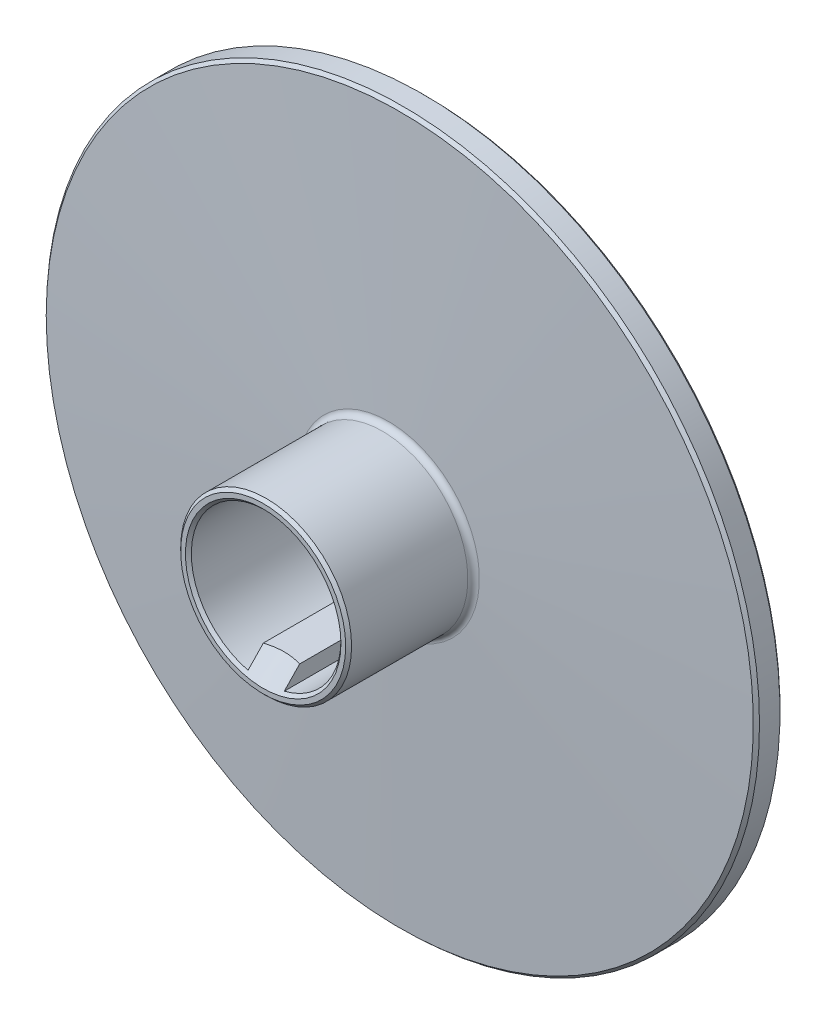
ISO-10303-21;
HEADER;
FILE_DESCRIPTION(('STEP AP214'),'2;1');
FILE_NAME('part.step','',(''),(''),'','','');
FILE_SCHEMA(('AUTOMOTIVE_DESIGN { 1 0 10303 214 1 1 1 1 }'));
ENDSEC;
DATA;
#1=APPLICATION_CONTEXT('core data for automotive mechanical design processes');
#2=APPLICATION_PROTOCOL_DEFINITION('international standard','automotive_design',2000,#1);
#3=PRODUCT_CONTEXT('',#1,'mechanical');
#4=PRODUCT('Part','Part','',(#3));
#5=PRODUCT_RELATED_PRODUCT_CATEGORY('part','',(#4));
#6=PRODUCT_DEFINITION_FORMATION('','',#4);
#7=PRODUCT_DEFINITION_CONTEXT('part definition',#1,'design');
#8=PRODUCT_DEFINITION('design','',#6,#7);
#9=PRODUCT_DEFINITION_SHAPE('','',#8);
#10=(LENGTH_UNIT() NAMED_UNIT(*) SI_UNIT(.MILLI.,.METRE.));
#11=(NAMED_UNIT(*) PLANE_ANGLE_UNIT() SI_UNIT($,.RADIAN.));
#12=(NAMED_UNIT(*) SI_UNIT($,.STERADIAN.) SOLID_ANGLE_UNIT());
#13=UNCERTAINTY_MEASURE_WITH_UNIT(LENGTH_MEASURE(1.E-05),#10,'distance_accuracy_value','');
#14=(GEOMETRIC_REPRESENTATION_CONTEXT(3) GLOBAL_UNCERTAINTY_ASSIGNED_CONTEXT((#13)) GLOBAL_UNIT_ASSIGNED_CONTEXT((#10,
#11,#12)) REPRESENTATION_CONTEXT('',''));
#15=CARTESIAN_POINT('',(0.,0.,0.));
#16=DIRECTION('',(0.,0.,1.));
#17=DIRECTION('',(1.,0.,0.));
#18=AXIS2_PLACEMENT_3D('',#15,#16,#17);
#19=CARTESIAN_POINT('',(-14.5,0.,33.7));
#20=DIRECTION('',(0.,0.,1.));
#21=DIRECTION('',(1.,0.,0.));
#22=AXIS2_PLACEMENT_3D('',#19,#20,#21);
#23=PLANE('',#22);
#24=CARTESIAN_POINT('',(0.,0.,33.7));
#25=DIRECTION('',(0.,0.,1.));
#26=DIRECTION('',(1.,0.,0.));
#27=AXIS2_PLACEMENT_3D('',#24,#25,#26);
#28=CIRCLE('',#27,14.);
#29=CARTESIAN_POINT('',(14.,0.,33.7));
#30=VERTEX_POINT('',#29);
#31=EDGE_CURVE('E222',#30,#30,#28,.T.);
#32=ORIENTED_EDGE('',*,*,#31,.T.);
#33=EDGE_LOOP('',(#32));
#34=FACE_BOUND('',#33,.T.);
#35=CARTESIAN_POINT('',(0.,0.,33.7));
#36=DIRECTION('',(0.,0.,1.));
#37=DIRECTION('',(1.,0.,0.));
#38=AXIS2_PLACEMENT_3D('',#35,#36,#37);
#39=CIRCLE('',#38,13.195);
#40=CARTESIAN_POINT('',(13.195,0.,33.7));
#41=VERTEX_POINT('',#40);
#42=EDGE_CURVE('E109',#41,#41,#39,.T.);
#43=ORIENTED_EDGE('',*,*,#42,.F.);
#44=EDGE_LOOP('',(#43));
#45=FACE_BOUND('',#44,.T.);
#46=ADVANCED_FACE('F43',(#34,#45),#23,.T.);
#47=CARTESIAN_POINT('',(0.,0.,0.));
#48=DIRECTION('',(0.,0.,1.));
#49=DIRECTION('',(1.,0.,0.));
#50=AXIS2_PLACEMENT_3D('',#47,#48,#49);
#51=CYLINDRICAL_SURFACE('',#50,12.695);
#52=CARTESIAN_POINT('',(0.,0.,0.));
#53=DIRECTION('',(0.,0.,1.));
#54=DIRECTION('',(1.,0.,0.));
#55=AXIS2_PLACEMENT_3D('',#52,#53,#54);
#56=CIRCLE('',#55,12.695);
#57=CARTESIAN_POINT('',(12.695,0.,0.));
#58=VERTEX_POINT('',#57);
#59=EDGE_CURVE('E240',#58,#58,#56,.T.);
#60=ORIENTED_EDGE('',*,*,#59,.F.);
#61=EDGE_LOOP('',(#60));
#62=FACE_BOUND('',#61,.T.);
#63=CARTESIAN_POINT('',(0.,0.,33.2));
#64=DIRECTION('',(0.,0.,1.));
#65=DIRECTION('',(1.,0.,0.));
#66=AXIS2_PLACEMENT_3D('',#63,#64,#65);
#67=CIRCLE('',#66,12.695);
#68=CARTESIAN_POINT('',(-3.075,-12.3169557927274,33.2));
#69=VERTEX_POINT('',#68);
#70=CARTESIAN_POINT('',(3.075,-12.3169557927274,33.2));
#71=VERTEX_POINT('',#70);
#72=EDGE_CURVE('E102',#69,#71,#67,.F.);
#73=ORIENTED_EDGE('',*,*,#72,.F.);
#74=DIRECTION('',(0.,0.,1.));
#75=VECTOR('',#74,1.);
#76=CARTESIAN_POINT('',(-3.075,-12.3169557927274,13.7));
#77=LINE('',#76,#75);
#78=CARTESIAN_POINT('',(-3.075,-12.3169557927274,14.4930442072727));
#79=VERTEX_POINT('',#78);
#80=EDGE_CURVE('E243',#79,#69,#77,.T.);
#81=ORIENTED_EDGE('',*,*,#80,.F.);
#82=CARTESIAN_POINT('',(0.,0.,26.8100000000002));
#83=DIRECTION('',(0.,0.707106781186551,-0.707106781186544));
#84=DIRECTION('',(0.,0.707106781186544,0.707106781186551));
#85=AXIS2_PLACEMENT_3D('',#82,#83,#84);
#86=ELLIPSE('',#85,17.9534411743265,12.695);
#87=CARTESIAN_POINT('',(3.075,-12.3169557927274,14.4930442072727));
#88=VERTEX_POINT('',#87);
#89=EDGE_CURVE('E58',#79,#88,#86,.F.);
#90=ORIENTED_EDGE('',*,*,#89,.T.);
#91=DIRECTION('',(0.,0.,1.));
#92=VECTOR('',#91,1.);
#93=CARTESIAN_POINT('',(3.075,-12.3169557927274,13.7));
#94=LINE('',#93,#92);
#95=EDGE_CURVE('E92',#88,#71,#94,.T.);
#96=ORIENTED_EDGE('',*,*,#95,.T.);
#97=EDGE_LOOP('',(#73,#81,#90,#96));
#98=FACE_BOUND('',#97,.T.);
#99=ADVANCED_FACE('F149',(#62,#98),#51,.F.);
#100=CARTESIAN_POINT('',(-3.075,-12.3169557927274,13.7));
#101=DIRECTION('',(-1.,0.,0.));
#102=DIRECTION('',(0.,0.,1.));
#103=AXIS2_PLACEMENT_3D('',#100,#101,#102);
#104=PLANE('',#103);
#105=DIRECTION('',(0.,0.,1.));
#106=VECTOR('',#105,1.);
#107=CARTESIAN_POINT('',(-3.075,-9.61,13.7));
#108=LINE('',#107,#106);
#109=CARTESIAN_POINT('',(-3.075,-9.61,17.2000000000001));
#110=VERTEX_POINT('',#109);
#111=CARTESIAN_POINT('',(-3.075,-9.61,30.5949814172277));
#112=VERTEX_POINT('',#111);
#113=EDGE_CURVE('E91',#110,#112,#108,.T.);
#114=ORIENTED_EDGE('',*,*,#113,.F.);
#115=DIRECTION('',(0.,-0.707106781186544,-0.707106781186551));
#116=VECTOR('',#115,1.);
#117=CARTESIAN_POINT('',(-3.075,-12.7134778963637,14.0965221036363));
#118=LINE('',#117,#116);
#119=EDGE_CURVE('E203',#110,#79,#118,.T.);
#120=ORIENTED_EDGE('',*,*,#119,.T.);
#121=ORIENTED_EDGE('',*,*,#80,.T.);
#122=CARTESIAN_POINT('',(-3.075,-16.4446644747525,37.2346926058785));
#123=CARTESIAN_POINT('',(-3.075,-16.1677862360648,36.9625333131866));
#124=CARTESIAN_POINT('',(-3.075,-15.8907938647849,36.6904901629675));
#125=CARTESIAN_POINT('',(-3.075,-15.3365379246369,36.1466798445369));
#126=CARTESIAN_POINT('',(-3.075,-15.059274355554,35.8749126765443));
#127=CARTESIAN_POINT('',(-3.075,-14.2271028429799,35.0601791897137));
#128=CARTESIAN_POINT('',(-3.075,-13.6717245654893,34.5176928296877));
#129=CARTESIAN_POINT('',(-3.075,-12.5596218359848,33.4349505824403));
#130=CARTESIAN_POINT('',(-3.075,-12.0028987330688,32.8946933100551));
#131=CARTESIAN_POINT('',(-3.075,-10.8867687744077,31.816770326622));
#132=CARTESIAN_POINT('',(-3.075,-10.3273614973255,31.2791050508895));
#133=CARTESIAN_POINT('',(-3.075,-9.48479183044669,30.4754507020256));
#134=CARTESIAN_POINT('',(-3.075,-9.20316229951289,30.207855254054));
#135=CARTESIAN_POINT('',(-3.075,-8.63857514852098,29.6740841048075));
#136=CARTESIAN_POINT('',(-3.075,-8.35561756670372,29.4079083631184));
#137=CARTESIAN_POINT('',(-3.075,-7.78806767612506,28.8775387579183));
#138=CARTESIAN_POINT('',(-3.075,-7.50347609219446,28.6133441199496));
#139=CARTESIAN_POINT('',(-3.075,-6.93189608596689,28.0874961983878));
#140=CARTESIAN_POINT('',(-3.075,-6.64490741266441,27.8258431873005));
#141=CARTESIAN_POINT('',(-3.075,-6.06722822566415,27.3058030379035));
#142=CARTESIAN_POINT('',(-3.075,-5.77653301306935,27.0474210938836));
#143=CARTESIAN_POINT('',(-3.075,-5.33693396746313,26.6640110336209));
#144=CARTESIAN_POINT('',(-3.075,-5.18983036718506,26.5369200624946));
#145=CARTESIAN_POINT('',(-3.075,-4.89413413816716,26.2844659756859));
#146=CARTESIAN_POINT('',(-3.075,-4.745541444885,26.1591029354622));
#147=CARTESIAN_POINT('',(-3.075,-4.44629407144802,25.9103880172487));
#148=CARTESIAN_POINT('',(-3.075,-4.29563659134671,25.7870394992981));
#149=CARTESIAN_POINT('',(-3.075,-3.99202986520318,25.543227710025));
#150=CARTESIAN_POINT('',(-3.075,-3.83908090572454,25.4227640827451));
#151=CARTESIAN_POINT('',(-3.075,-3.53008505213791,25.1855225796602));
#152=CARTESIAN_POINT('',(-3.075,-3.37403519062184,25.0687485416265));
#153=CARTESIAN_POINT('',(-3.075,-3.13708715737065,24.8974903372774));
#154=CARTESIAN_POINT('',(-3.075,-3.05760843489313,24.8410431804734));
#155=CARTESIAN_POINT('',(-3.075,-2.89755449301305,24.7297082760135));
#156=CARTESIAN_POINT('',(-3.075,-2.81697915534513,24.6748206985545));
#157=CARTESIAN_POINT('',(-3.075,-2.7357895650353,24.6208437220278));
#158=B_SPLINE_CURVE_WITH_KNOTS('',3,(#122,#123,#124,#125,#126,#127,#128,#129,#130,#131,#132,
#133,#134,#135,#136,#137,#138,#139,#140,#141,#142,#143,#144,#145,#146,#147,#148,#149,#150,#151,
#152,#153,#154,#155,#156,#157),.UNSPECIFIED.,.F.,.F.,(4,2,2,2,2,2,2,2,2,2,2,2,2,2,2,2,2,4),(0.,
1.16472739296026,2.32945570897109,4.65853560982455,6.9858398640117,9.31352223834014,
10.4789810750029,11.6444065560004,12.809349827676,13.9744166522994,15.1411463401531,
15.7243379188744,16.3075548853717,16.8916616157107,17.4756958997393,18.0603189104059,
18.3527545571148,18.6452219957069),.UNSPECIFIED.);
#159=EDGE_CURVE('E108',#69,#112,#158,.T.);
#160=ORIENTED_EDGE('',*,*,#159,.T.);
#161=EDGE_LOOP('',(#114,#120,#121,#160));
#162=FACE_BOUND('',#161,.T.);
#163=ADVANCED_FACE('F133',(#162),#104,.T.);
#164=CARTESIAN_POINT('',(-3.075,-9.61,13.7));
#165=DIRECTION('',(0.,1.,0.));
#166=DIRECTION('',(0.,0.,1.));
#167=AXIS2_PLACEMENT_3D('',#164,#165,#166);
#168=PLANE('',#167);
#169=DIRECTION('',(0.,0.,1.));
#170=VECTOR('',#169,1.);
#171=CARTESIAN_POINT('',(3.075,-9.61,13.7));
#172=LINE('',#171,#170);
#173=CARTESIAN_POINT('',(3.075,-9.61,17.2000000000001));
#174=VERTEX_POINT('',#173);
#175=CARTESIAN_POINT('',(3.075,-9.61,30.5949814172277));
#176=VERTEX_POINT('',#175);
#177=EDGE_CURVE('E81',#174,#176,#172,.T.);
#178=ORIENTED_EDGE('',*,*,#177,.F.);
#179=DIRECTION('',(-1.,0.,0.));
#180=VECTOR('',#179,1.);
#181=CARTESIAN_POINT('',(-3.075,-9.61,17.2000000000001));
#182=LINE('',#181,#180);
#183=EDGE_CURVE('E103',#174,#110,#182,.T.);
#184=ORIENTED_EDGE('',*,*,#183,.T.);
#185=ORIENTED_EDGE('',*,*,#113,.T.);
#186=CARTESIAN_POINT('',(-6.79762357745146,-9.61,32.2761420984));
#187=CARTESIAN_POINT('',(-6.62557662032749,-9.61,32.1768012971119));
#188=CARTESIAN_POINT('',(-6.45244053606338,-9.61,32.0793196729718));
#189=CARTESIAN_POINT('',(-6.103779800293,-9.61,31.8886216347219));
#190=CARTESIAN_POINT('',(-5.92825454384466,-9.61,31.7954063279312));
#191=CARTESIAN_POINT('',(-5.57398864840463,-9.61,31.6134775332071));
#192=CARTESIAN_POINT('',(-5.39523797660943,-9.61,31.5247834851891));
#193=CARTESIAN_POINT('',(-5.03508492186639,-9.61,31.3530018568147));
#194=CARTESIAN_POINT('',(-4.85368272204503,-9.61,31.2699138914821));
#195=CARTESIAN_POINT('',(-4.29961370824561,-9.61,31.0276968134661));
#196=CARTESIAN_POINT('',(-3.92252151864071,-9.61,30.8784598606364));
#197=CARTESIAN_POINT('',(-3.15703238978467,-9.61,30.6139345759531));
#198=CARTESIAN_POINT('',(-2.76865540956623,-9.61,30.4985898904294));
#199=CARTESIAN_POINT('',(-2.13611359057168,-9.61,30.3468037743358));
#200=CARTESIAN_POINT('',(-1.89509988037997,-9.61,30.2971567897843));
#201=CARTESIAN_POINT('',(-1.41011619384995,-9.61,30.2149675381337));
#202=CARTESIAN_POINT('',(-1.16614607439211,-9.61,30.1824261025244));
#203=CARTESIAN_POINT('',(-0.678456181416897,-9.61,30.1358869576372));
#204=CARTESIAN_POINT('',(-0.434750919192085,-9.61,30.1217386138091));
#205=CARTESIAN_POINT('',(0.0530333547881221,-9.61,30.112051550942));
#206=CARTESIAN_POINT('',(0.297112375028715,-9.61,30.1165132608497));
#207=CARTESIAN_POINT('',(0.821333873306593,-9.61,30.1459662260996));
#208=CARTESIAN_POINT('',(1.10130902391229,-9.61,30.1739797932255));
#209=CARTESIAN_POINT('',(1.65797893360702,-9.61,30.2530763687466));
#210=CARTESIAN_POINT('',(1.93467302401662,-9.61,30.3041639994393));
#211=CARTESIAN_POINT('',(2.48675226866024,-9.61,30.4278386769668));
#212=CARTESIAN_POINT('',(2.76207900209486,-9.61,30.5006835821635));
#213=CARTESIAN_POINT('',(3.30705706759394,-9.61,30.6647824900906));
#214=CARTESIAN_POINT('',(3.5767095671241,-9.61,30.7560326642447));
#215=CARTESIAN_POINT('',(4.19197603864613,-9.61,30.9845021416316));
#216=CARTESIAN_POINT('',(4.5355324443071,-9.61,31.1272378437436));
#217=CARTESIAN_POINT('',(5.21319787826299,-9.61,31.4337747267892));
#218=CARTESIAN_POINT('',(5.54730162685242,-9.61,31.5975874074029));
#219=CARTESIAN_POINT('',(6.20801907400099,-9.61,31.9423030464894));
#220=CARTESIAN_POINT('',(6.5346018704139,-9.61,32.1232647755324));
#221=CARTESIAN_POINT('',(7.18008086690026,-9.61,32.4981926672421));
#222=CARTESIAN_POINT('',(7.49897849482747,-9.61,32.6921563885019));
#223=CARTESIAN_POINT('',(8.11529067983245,-9.61,33.0809949563438));
#224=CARTESIAN_POINT('',(8.41300786398465,-9.61,33.2753926300923));
#225=CARTESIAN_POINT('',(9.00335025477699,-9.61,33.6717993943322));
#226=CARTESIAN_POINT('',(9.29597504323243,-9.61,33.8738091056483));
#227=CARTESIAN_POINT('',(9.87432008759516,-9.61,34.2822516343032));
#228=CARTESIAN_POINT('',(10.160078173652,-9.61,34.4886310732012));
#229=CARTESIAN_POINT('',(10.7277790558356,-9.61,34.906417444048));
#230=CARTESIAN_POINT('',(11.0097228740249,-9.61,35.1178229856014));
#231=CARTESIAN_POINT('',(11.2900880913767,-9.61,35.3312668636122));
#232=B_SPLINE_CURVE_WITH_KNOTS('',3,(#186,#187,#188,#189,#190,#191,#192,#193,#194,#195,#196,
#197,#198,#199,#200,#201,#202,#203,#204,#205,#206,#207,#208,#209,#210,#211,#212,#213,#214,#215,
#216,#217,#218,#219,#220,#221,#222,#223,#224,#225,#226,#227,#228,#229,#230,#231),.UNSPECIFIED.,
.F.,.F.,(4,2,2,2,2,2,2,2,2,2,2,2,2,2,2,2,2,2,2,2,2,2,4),(0.,0.596009878422831,1.19217358347285,
1.79071526127652,2.38921579460725,3.60459016431211,4.81793210904762,5.55562336232361,
6.29335047098304,7.02499691670724,7.75666022638449,8.59972351915994,9.44295577302999,
10.296607469739,11.150081776684,12.2652223201028,13.3809738891778,14.5006979036308,
15.62021225133,16.686766391578,17.7534077072479,18.8108220768357,19.8679472562639),.UNSPECIFIED.);
#233=EDGE_CURVE('E99',#112,#176,#232,.T.);
#234=ORIENTED_EDGE('',*,*,#233,.T.);
#235=EDGE_LOOP('',(#178,#184,#185,#234));
#236=FACE_BOUND('',#235,.T.);
#237=ADVANCED_FACE('F106',(#236),#168,.T.);
#238=CARTESIAN_POINT('',(3.075,-12.3169557927274,13.7));
#239=DIRECTION('',(1.,0.,0.));
#240=DIRECTION('',(0.,0.,-1.));
#241=AXIS2_PLACEMENT_3D('',#238,#239,#240);
#242=PLANE('',#241);
#243=ORIENTED_EDGE('',*,*,#95,.F.);
#244=DIRECTION('',(0.,0.707106781186544,0.707106781186551));
#245=VECTOR('',#244,1.);
#246=CARTESIAN_POINT('',(3.075,-12.7134778963637,14.0965221036363));
#247=LINE('',#246,#245);
#248=EDGE_CURVE('E86',#88,#174,#247,.T.);
#249=ORIENTED_EDGE('',*,*,#248,.T.);
#250=ORIENTED_EDGE('',*,*,#177,.T.);
#251=CARTESIAN_POINT('',(3.075,-2.7357895650353,24.6208437220278));
#252=CARTESIAN_POINT('',(3.075,-2.8200841733317,24.676888618064));
#253=CARTESIAN_POINT('',(3.075,-2.90371958637137,24.7339118082354));
#254=CARTESIAN_POINT('',(3.075,-3.06981333236709,24.8496286235785));
#255=CARTESIAN_POINT('',(3.075,-3.15227180335314,24.9083220504097));
#256=CARTESIAN_POINT('',(3.075,-3.31613675478941,25.0270804204322));
#257=CARTESIAN_POINT('',(3.075,-3.39754368248909,25.0871447483026));
#258=CARTESIAN_POINT('',(3.075,-3.55946872628302,25.2084635600195));
#259=CARTESIAN_POINT('',(3.075,-3.6399868121207,25.2697180841861));
#260=CARTESIAN_POINT('',(3.075,-3.88020039385183,25.4548631656667));
#261=CARTESIAN_POINT('',(3.075,-4.03873189017413,25.5802644451658));
#262=CARTESIAN_POINT('',(3.075,-4.35339164711366,25.8340729888377));
#263=CARTESIAN_POINT('',(3.075,-4.50951958807305,25.9624806472123));
#264=CARTESIAN_POINT('',(3.075,-4.81961857223347,26.2213870263406));
#265=CARTESIAN_POINT('',(3.075,-4.97359258012751,26.3518822025072));
#266=CARTESIAN_POINT('',(3.075,-5.28000055140545,26.6146504096596));
#267=CARTESIAN_POINT('',(3.075,-5.43243458586553,26.7469233579309));
#268=CARTESIAN_POINT('',(3.075,-5.73610369739013,27.0129294798348));
#269=CARTESIAN_POINT('',(3.075,-5.88733839534715,27.1466630857253));
#270=CARTESIAN_POINT('',(3.075,-6.18878336256179,27.4152820407836));
#271=CARTESIAN_POINT('',(3.075,-6.33899362005434,27.5501674031388));
#272=CARTESIAN_POINT('',(3.075,-6.76585355197218,27.93589871173));
#273=CARTESIAN_POINT('',(3.075,-7.04147684777185,28.1878802428342));
#274=CARTESIAN_POINT('',(3.075,-7.59058417895442,28.6940985201818));
#275=CARTESIAN_POINT('',(3.075,-7.86406844133737,28.9483350208392));
#276=CARTESIAN_POINT('',(3.075,-8.40963312309638,29.4586722678215));
#277=CARTESIAN_POINT('',(3.075,-8.68171248359501,29.714774145219));
#278=CARTESIAN_POINT('',(3.075,-9.22465558622633,30.2282794239617));
#279=CARTESIAN_POINT('',(3.075,-9.49551928896499,30.4856828669181));
#280=CARTESIAN_POINT('',(3.075,-10.3279621976556,31.2796776540167));
#281=CARTESIAN_POINT('',(3.075,-10.8879656899572,31.8179204491862));
#282=CARTESIAN_POINT('',(3.075,-12.0053717124883,32.8970874058707));
#283=CARTESIAN_POINT('',(3.075,-12.5627742560463,33.4380115536158));
#284=CARTESIAN_POINT('',(3.075,-13.6749593019903,34.5208504299196));
#285=CARTESIAN_POINT('',(3.075,-14.2297445051434,35.0627623855056));
#286=CARTESIAN_POINT('',(3.075,-15.0609820387358,35.8765861264441));
#287=CARTESIAN_POINT('',(3.075,-15.3379035829512,36.1480191013643));
#288=CARTESIAN_POINT('',(3.075,-15.8914761947861,36.691160299024));
#289=CARTESIAN_POINT('',(3.075,-16.1681272626192,36.9628685215457));
#290=CARTESIAN_POINT('',(3.075,-16.4446644747525,37.2346926058785));
#291=B_SPLINE_CURVE_WITH_KNOTS('',3,(#251,#252,#253,#254,#255,#256,#257,#258,#259,#260,#261,
#262,#263,#264,#265,#266,#267,#268,#269,#270,#271,#272,#273,#274,#275,#276,#277,#278,#279,#280,
#281,#282,#283,#284,#285,#286,#287,#288,#289,#290),.UNSPECIFIED.,.F.,.F.,(4,2,2,2,2,2,2,2,2,2,2,
2,2,2,2,2,2,2,2,4),(0.,0.303659187927709,0.6072824655991,0.910772044370865,1.21427192239943,
1.82061523644861,2.42703850559754,3.03252305134819,3.63797952260694,4.24362030438228,
4.84926802989535,5.96958931533973,7.08979005058529,8.21073849423838,9.3317230042708,
11.6618953018111,13.9920556453601,16.3186586565968,17.4819524045281,18.6452452323606),.UNSPECIFIED.);
#292=EDGE_CURVE('E84',#176,#71,#291,.T.);
#293=ORIENTED_EDGE('',*,*,#292,.T.);
#294=EDGE_LOOP('',(#243,#249,#250,#293));
#295=FACE_BOUND('',#294,.T.);
#296=ADVANCED_FACE('F83',(#295),#242,.T.);
#297=CARTESIAN_POINT('',(0.,0.,6.));
#298=DIRECTION('',(0.,0.,-1.));
#299=DIRECTION('',(-1.,0.,0.));
#300=AXIS2_PLACEMENT_3D('',#297,#298,#299);
#301=CYLINDRICAL_SURFACE('',#300,22.25);
#302=CARTESIAN_POINT('',(0.,0.,0.5));
#303=DIRECTION('',(0.,0.,1.));
#304=DIRECTION('',(1.,0.,0.));
#305=AXIS2_PLACEMENT_3D('',#302,#303,#304);
#306=CIRCLE('',#305,22.25);
#307=CARTESIAN_POINT('',(22.25,0.,0.5));
#308=VERTEX_POINT('',#307);
#309=EDGE_CURVE('E231',#308,#308,#306,.T.);
#310=ORIENTED_EDGE('',*,*,#309,.T.);
#311=EDGE_LOOP('',(#310));
#312=FACE_BOUND('',#311,.T.);
#313=CARTESIAN_POINT('',(0.,0.,5.));
#314=DIRECTION('',(0.,0.,-1.));
#315=DIRECTION('',(-1.,0.,0.));
#316=AXIS2_PLACEMENT_3D('',#313,#314,#315);
#317=CIRCLE('',#316,22.25);
#318=CARTESIAN_POINT('',(-22.25,0.,5.));
#319=VERTEX_POINT('',#318);
#320=EDGE_CURVE('E234',#319,#319,#317,.T.);
#321=ORIENTED_EDGE('',*,*,#320,.T.);
#322=EDGE_LOOP('',(#321));
#323=FACE_BOUND('',#322,.T.);
#324=ADVANCED_FACE('F148',(#312,#323),#301,.T.);
#325=CARTESIAN_POINT('',(0.,0.,0.));
#326=DIRECTION('',(0.,0.,1.));
#327=DIRECTION('',(1.,0.,0.));
#328=AXIS2_PLACEMENT_3D('',#325,#326,#327);
#329=PLANE('',#328);
#330=CARTESIAN_POINT('',(0.,0.,0.));
#331=DIRECTION('',(0.,0.,1.));
#332=DIRECTION('',(1.,0.,0.));
#333=AXIS2_PLACEMENT_3D('',#330,#331,#332);
#334=CIRCLE('',#333,21.75);
#335=CARTESIAN_POINT('',(21.75,0.,0.));
#336=VERTEX_POINT('',#335);
#337=EDGE_CURVE('E228',#336,#336,#334,.F.);
#338=ORIENTED_EDGE('',*,*,#337,.T.);
#339=EDGE_LOOP('',(#338));
#340=FACE_BOUND('',#339,.T.);
#341=ORIENTED_EDGE('',*,*,#59,.T.);
#342=EDGE_LOOP('',(#341));
#343=FACE_BOUND('',#342,.T.);
#344=ADVANCED_FACE('F166',(#340,#343),#329,.F.);
#345=CARTESIAN_POINT('',(-60.5,0.,6.));
#346=DIRECTION('',(0.,0.,-1.));
#347=DIRECTION('',(-1.,0.,0.));
#348=AXIS2_PLACEMENT_3D('',#345,#346,#347);
#349=PLANE('',#348);
#350=CARTESIAN_POINT('',(0.,0.,6.));
#351=DIRECTION('',(0.,0.,-1.));
#352=DIRECTION('',(-1.,0.,0.));
#353=AXIS2_PLACEMENT_3D('',#350,#351,#352);
#354=CIRCLE('',#353,60.);
#355=CARTESIAN_POINT('',(-60.,0.,6.));
#356=VERTEX_POINT('',#355);
#357=EDGE_CURVE('E217',#356,#356,#354,.T.);
#358=ORIENTED_EDGE('',*,*,#357,.T.);
#359=EDGE_LOOP('',(#358));
#360=FACE_BOUND('',#359,.T.);
#361=CARTESIAN_POINT('',(0.,0.,6.));
#362=DIRECTION('',(0.,0.,-1.));
#363=DIRECTION('',(-1.,0.,0.));
#364=AXIS2_PLACEMENT_3D('',#361,#362,#363);
#365=CIRCLE('',#364,23.25);
#366=CARTESIAN_POINT('',(-23.25,0.,6.));
#367=VERTEX_POINT('',#366);
#368=EDGE_CURVE('E237',#367,#367,#365,.F.);
#369=ORIENTED_EDGE('',*,*,#368,.T.);
#370=EDGE_LOOP('',(#369));
#371=FACE_BOUND('',#370,.T.);
#372=ADVANCED_FACE('F162',(#360,#371),#349,.T.);
#373=CARTESIAN_POINT('',(0.,0.,10.5));
#374=DIRECTION('',(0.,0.,-1.));
#375=DIRECTION('',(-1.,0.,0.));
#376=AXIS2_PLACEMENT_3D('',#373,#374,#375);
#377=CONICAL_SURFACE('',#376,60.5,1.52716309549505);
#378=CARTESIAN_POINT('',(0.,0.,12.4666468944641));
#379=DIRECTION('',(0.,0.,-1.));
#380=DIRECTION('',(-1.,0.,0.));
#381=AXIS2_PLACEMENT_3D('',#378,#379,#380);
#382=CIRCLE('',#381,15.4563806126347);
#383=CARTESIAN_POINT('',(-15.4563806126355,0.,12.4666468944641));
#384=VERTEX_POINT('',#383);
#385=EDGE_CURVE('E52',#384,#384,#382,.T.);
#386=CARTESIAN_POINT('',(0.,0.,10.5218096936827));
#387=DIRECTION('',(0.,0.,1.));
#388=DIRECTION('',(1.,0.,0.));
#389=AXIS2_PLACEMENT_3D('',#386,#387,#388);
#390=CIRCLE('',#389,60.0004758892091);
#391=CARTESIAN_POINT('',(-60.0004758892091,0.,10.5218096936827));
#392=VERTEX_POINT('',#391);
#393=EDGE_CURVE('E104',#392,#392,#390,.T.);
#394=CARTESIAN_POINT('',(-15.4563806126355,0.,12.4666468944641));
#395=CARTESIAN_POINT('',(-15.9203816050998,0.,12.4463881736227));
#396=CARTESIAN_POINT('',(-16.3843825975641,0.,12.4261294527812));
#397=CARTESIAN_POINT('',(-17.3123845824927,0.,12.3856120110982));
#398=CARTESIAN_POINT('',(-17.776385574957,0.,12.3653532902568));
#399=CARTESIAN_POINT('',(-18.7043875598857,0.,12.3248358485738));
#400=CARTESIAN_POINT('',(-19.16838855235,0.,12.3045771277324));
#401=CARTESIAN_POINT('',(-20.0963905372786,0.,12.2640596860494));
#402=CARTESIAN_POINT('',(-20.5603915297429,0.,12.2438009652079));
#403=CARTESIAN_POINT('',(-21.4883935146715,0.,12.203283523525));
#404=CARTESIAN_POINT('',(-21.9523945071358,0.,12.1830248026835));
#405=CARTESIAN_POINT('',(-22.8803964920644,0.,12.1425073610006));
#406=CARTESIAN_POINT('',(-23.3443974845287,0.,12.1222486401591));
#407=CARTESIAN_POINT('',(-24.2723994694574,0.,12.0817311984761));
#408=CARTESIAN_POINT('',(-24.7364004619217,0.,12.0614724776347));
#409=CARTESIAN_POINT('',(-25.6644024468503,0.,12.0209550359517));
#410=CARTESIAN_POINT('',(-26.1284034393146,0.,12.0006963151102));
#411=CARTESIAN_POINT('',(-27.0564054242432,0.,11.9601788734273));
#412=CARTESIAN_POINT('',(-27.5204064167075,0.,11.9399201525858));
#413=CARTESIAN_POINT('',(-28.4484084016361,0.,11.8994027109029));
#414=CARTESIAN_POINT('',(-28.9124093941005,0.,11.8791439900614));
#415=CARTESIAN_POINT('',(-29.8404113790291,0.,11.8386265483785));
#416=CARTESIAN_POINT('',(-30.3044123714934,0.,11.818367827537));
#417=CARTESIAN_POINT('',(-31.232414356422,0.,11.777850385854));
#418=CARTESIAN_POINT('',(-31.6964153488863,0.,11.7575916650126));
#419=CARTESIAN_POINT('',(-32.6244173338149,0.,11.7170742233296));
#420=CARTESIAN_POINT('',(-33.0884183262792,0.,11.6968155024881));
#421=CARTESIAN_POINT('',(-34.0164203112079,0.,11.6562980608052));
#422=CARTESIAN_POINT('',(-34.4804213036722,0.,11.6360393399637));
#423=CARTESIAN_POINT('',(-35.4084232886008,0.,11.5955218982808));
#424=CARTESIAN_POINT('',(-35.8724242810651,0.,11.5752631774393));
#425=CARTESIAN_POINT('',(-36.8004262659937,0.,11.5347457357563));
#426=CARTESIAN_POINT('',(-37.264427258458,0.,11.5144870149149));
#427=CARTESIAN_POINT('',(-38.1924292433866,0.,11.4739695732319));
#428=CARTESIAN_POINT('',(-38.6564302358509,0.,11.4537108523905));
#429=CARTESIAN_POINT('',(-39.5844322207795,0.,11.4131934107075));
#430=CARTESIAN_POINT('',(-40.0484332132439,0.,11.392934689866));
#431=CARTESIAN_POINT('',(-40.9764351981725,0.,11.3524172481831));
#432=CARTESIAN_POINT('',(-41.4404361906368,0.,11.3321585273416));
#433=CARTESIAN_POINT('',(-42.3684381755654,0.,11.2916410856587));
#434=CARTESIAN_POINT('',(-42.8324391680297,0.,11.2713823648172));
#435=CARTESIAN_POINT('',(-43.7604411529583,0.,11.2308649231342));
#436=CARTESIAN_POINT('',(-44.2244421454226,0.,11.2106062022928));
#437=CARTESIAN_POINT('',(-45.1524441303512,0.,11.1700887606098));
#438=CARTESIAN_POINT('',(-45.6164451228156,0.,11.1498300397684));
#439=CARTESIAN_POINT('',(-46.5444471077442,0.,11.1093125980854));
#440=CARTESIAN_POINT('',(-47.0084481002085,0.,11.0890538772439));
#441=CARTESIAN_POINT('',(-47.9364500851371,0.,11.048536435561));
#442=CARTESIAN_POINT('',(-48.4004510776014,0.,11.0282777147195));
#443=CARTESIAN_POINT('',(-49.32845306253,0.,10.9877602730366));
#444=CARTESIAN_POINT('',(-49.7924540549943,0.,10.9675015521951));
#445=CARTESIAN_POINT('',(-50.720456039923,0.,10.9269841105121));
#446=CARTESIAN_POINT('',(-51.1844570323873,0.,10.9067253896707));
#447=CARTESIAN_POINT('',(-52.1124590173159,0.,10.8662079479877));
#448=CARTESIAN_POINT('',(-52.5764600097802,0.,10.8459492271462));
#449=CARTESIAN_POINT('',(-53.5044619947088,0.,10.8054317854633));
#450=CARTESIAN_POINT('',(-53.9684629871731,0.,10.7851730646218));
#451=CARTESIAN_POINT('',(-54.8964649721017,0.,10.7446556229389));
#452=CARTESIAN_POINT('',(-55.360465964566,0.,10.7243969020974));
#453=CARTESIAN_POINT('',(-56.2884679494947,0.,10.6838794604145));
#454=CARTESIAN_POINT('',(-56.752468941959,0.,10.663620739573));
#455=CARTESIAN_POINT('',(-57.6804709268876,0.,10.62310329789));
#456=CARTESIAN_POINT('',(-58.1444719193519,0.,10.6028445770486));
#457=CARTESIAN_POINT('',(-59.0724739042805,0.,10.5623271353656));
#458=CARTESIAN_POINT('',(-59.5364748967448,0.,10.5420684145241));
#459=CARTESIAN_POINT('',(-60.0004758892091,0.,10.5218096936827));
#460=B_SPLINE_CURVE_WITH_KNOTS('',3,(#394,#395,#396,#397,#398,#399,#400,#401,#402,#403,#404,
#405,#406,#407,#408,#409,#410,#411,#412,#413,#414,#415,#416,#417,#418,#419,#420,#421,#422,#423,
#424,#425,#426,#427,#428,#429,#430,#431,#432,#433,#434,#435,#436,#437,#438,#439,#440,#441,#442,
#443,#444,#445,#446,#447,#448,#449,#450,#451,#452,#453,#454,#455,#456,#457,#458,#459),
.UNSPECIFIED.,.F.,.F.,(4,2,2,2,2,2,2,2,2,2,2,2,2,2,2,2,2,2,2,2,2,2,2,2,2,2,2,2,2,2,2,2,4),(0.,
1.39332911797679,2.78665823595357,4.17998735393036,5.57331647190714,6.96664558988393,
8.35997470786071,9.75330382583749,11.1466329438143,12.5399620617911,13.9332911797679,
15.3266202977446,16.7199494157214,18.1132785336982,19.506607651675,20.8999367696518,
22.2932658876286,23.6865950056054,25.0799241235821,26.4732532415589,27.8665823595357,
29.2599114775125,30.6532405954893,32.0465697134661,33.4398988314429,34.8332279494196,
36.2265570673964,37.6198861853732,39.01321530335,40.4065444213268,41.7998735393036,
43.1932026572803,44.5865317752571),.UNSPECIFIED.);
#461=EDGE_CURVE('BSEAM165',#384,#392,#460,.T.);
#462=ORIENTED_EDGE('',*,*,#385,.T.);
#463=ORIENTED_EDGE('',*,*,#393,.T.);
#464=ORIENTED_EDGE('',*,*,#461,.T.);
#465=ORIENTED_EDGE('',*,*,#461,.F.);
#466=EDGE_LOOP('',(#462,#464,#463,#465));
#467=FACE_BOUND('',#466,.T.);
#468=ADVANCED_FACE('F165',(#467),#377,.T.);
#469=CARTESIAN_POINT('',(0.,0.,33.7));
#470=DIRECTION('',(0.,0.,-1.));
#471=DIRECTION('',(-1.,0.,0.));
#472=AXIS2_PLACEMENT_3D('',#469,#470,#471);
#473=CYLINDRICAL_SURFACE('',#472,60.5);
#474=CARTESIAN_POINT('',(0.,0.,6.49999999999999));
#475=DIRECTION('',(0.,0.,-1.));
#476=DIRECTION('',(-1.,0.,0.));
#477=AXIS2_PLACEMENT_3D('',#474,#475,#476);
#478=CIRCLE('',#477,60.5);
#479=CARTESIAN_POINT('',(-60.5,0.,6.49999999999999));
#480=VERTEX_POINT('',#479);
#481=EDGE_CURVE('E212',#480,#480,#478,.F.);
#482=ORIENTED_EDGE('',*,*,#481,.T.);
#483=EDGE_LOOP('',(#482));
#484=FACE_BOUND('',#483,.T.);
#485=CARTESIAN_POINT('',(0.,0.,9.97667478508751));
#486=DIRECTION('',(0.,0.,1.));
#487=DIRECTION('',(1.,0.,0.));
#488=AXIS2_PLACEMENT_3D('',#485,#486,#487);
#489=CIRCLE('',#488,60.5);
#490=CARTESIAN_POINT('',(60.5,0.,9.97667478508751));
#491=VERTEX_POINT('',#490);
#492=EDGE_CURVE('E214',#491,#491,#489,.F.);
#493=ORIENTED_EDGE('',*,*,#492,.T.);
#494=EDGE_LOOP('',(#493));
#495=FACE_BOUND('',#494,.T.);
#496=ADVANCED_FACE('F157',(#484,#495),#473,.T.);
#497=CARTESIAN_POINT('',(0.,0.,33.7));
#498=DIRECTION('',(0.,0.,-1.));
#499=DIRECTION('',(-1.,0.,0.));
#500=AXIS2_PLACEMENT_3D('',#497,#498,#499);
#501=CYLINDRICAL_SURFACE('',#500,14.5);
#502=CARTESIAN_POINT('',(0.,0.,13.465695116046));
#503=DIRECTION('',(0.,0.,-1.));
#504=DIRECTION('',(-1.,0.,0.));
#505=AXIS2_PLACEMENT_3D('',#502,#503,#504);
#506=CIRCLE('',#505,14.5);
#507=CARTESIAN_POINT('',(-14.5,0.,13.465695116046));
#508=VERTEX_POINT('',#507);
#509=EDGE_CURVE('E11',#508,#508,#506,.F.);
#510=ORIENTED_EDGE('',*,*,#509,.T.);
#511=EDGE_LOOP('',(#510));
#512=FACE_BOUND('',#511,.T.);
#513=CARTESIAN_POINT('',(0.,0.,33.2));
#514=DIRECTION('',(0.,0.,1.));
#515=DIRECTION('',(1.,0.,0.));
#516=AXIS2_PLACEMENT_3D('',#513,#514,#515);
#517=CIRCLE('',#516,14.5);
#518=CARTESIAN_POINT('',(14.5,0.,33.2));
#519=VERTEX_POINT('',#518);
#520=EDGE_CURVE('E225',#519,#519,#517,.F.);
#521=ORIENTED_EDGE('',*,*,#520,.T.);
#522=EDGE_LOOP('',(#521));
#523=FACE_BOUND('',#522,.T.);
#524=ADVANCED_FACE('F153',(#512,#523),#501,.T.);
#525=CARTESIAN_POINT('',(0.,0.,5.));
#526=DIRECTION('',(0.,0.,-1.));
#527=DIRECTION('',(-1.,0.,0.));
#528=AXIS2_PLACEMENT_3D('',#525,#526,#527);
#529=TOROIDAL_SURFACE('',#528,23.25,1.);
#530=ORIENTED_EDGE('',*,*,#320,.F.);
#531=EDGE_LOOP('',(#530));
#532=FACE_BOUND('',#531,.T.);
#533=ORIENTED_EDGE('',*,*,#368,.F.);
#534=EDGE_LOOP('',(#533));
#535=FACE_BOUND('',#534,.T.);
#536=ADVANCED_FACE('F156',(#532,#535),#529,.F.);
#537=CARTESIAN_POINT('',(0.,0.,0.5));
#538=DIRECTION('',(0.,0.,1.));
#539=DIRECTION('',(1.,0.,0.));
#540=AXIS2_PLACEMENT_3D('',#537,#538,#539);
#541=CONICAL_SURFACE('',#540,22.25,0.785398163397455);
#542=ORIENTED_EDGE('',*,*,#337,.F.);
#543=EDGE_LOOP('',(#542));
#544=FACE_BOUND('',#543,.T.);
#545=ORIENTED_EDGE('',*,*,#309,.F.);
#546=EDGE_LOOP('',(#545));
#547=FACE_BOUND('',#546,.T.);
#548=ADVANCED_FACE('F182',(#544,#547),#541,.T.);
#549=CARTESIAN_POINT('',(0.,0.,33.2));
#550=DIRECTION('',(0.,0.,-1.));
#551=DIRECTION('',(-1.,0.,0.));
#552=AXIS2_PLACEMENT_3D('',#549,#550,#551);
#553=CONICAL_SURFACE('',#552,14.5,0.78539816339745);
#554=ORIENTED_EDGE('',*,*,#31,.F.);
#555=EDGE_LOOP('',(#554));
#556=FACE_BOUND('',#555,.T.);
#557=ORIENTED_EDGE('',*,*,#520,.F.);
#558=EDGE_LOOP('',(#557));
#559=FACE_BOUND('',#558,.T.);
#560=ADVANCED_FACE('F186',(#556,#559),#553,.T.);
#561=CARTESIAN_POINT('',(0.,0.,6.));
#562=DIRECTION('',(0.,0.,1.));
#563=DIRECTION('',(1.,0.,0.));
#564=AXIS2_PLACEMENT_3D('',#561,#562,#563);
#565=CONICAL_SURFACE('',#564,60.,0.785398163397483);
#566=ORIENTED_EDGE('',*,*,#481,.F.);
#567=EDGE_LOOP('',(#566));
#568=FACE_BOUND('',#567,.T.);
#569=ORIENTED_EDGE('',*,*,#357,.F.);
#570=EDGE_LOOP('',(#569));
#571=FACE_BOUND('',#570,.T.);
#572=ADVANCED_FACE('F190',(#568,#571),#565,.T.);
#573=CARTESIAN_POINT('',(0.,0.,9.97667478508751));
#574=DIRECTION('',(0.,0.,-1.));
#575=DIRECTION('',(-1.,0.,0.));
#576=AXIS2_PLACEMENT_3D('',#573,#574,#575);
#577=CONICAL_SURFACE('',#576,60.5,0.741764932097604);
#578=ORIENTED_EDGE('',*,*,#393,.F.);
#579=EDGE_LOOP('',(#578));
#580=FACE_BOUND('',#579,.T.);
#581=ORIENTED_EDGE('',*,*,#492,.F.);
#582=EDGE_LOOP('',(#581));
#583=FACE_BOUND('',#582,.T.);
#584=ADVANCED_FACE('F131',(#580,#583),#577,.T.);
#585=CARTESIAN_POINT('',(0.,0.,29.7));
#586=DIRECTION('',(0.,0.,1.));
#587=DIRECTION('',(1.,0.,0.));
#588=AXIS2_PLACEMENT_3D('',#585,#586,#587);
#589=CONICAL_SURFACE('',#588,9.195,0.785398163397448);
#590=ORIENTED_EDGE('',*,*,#42,.T.);
#591=EDGE_LOOP('',(#590));
#592=FACE_BOUND('',#591,.T.);
#593=ORIENTED_EDGE('',*,*,#72,.T.);
#594=ORIENTED_EDGE('',*,*,#292,.F.);
#595=ORIENTED_EDGE('',*,*,#233,.F.);
#596=ORIENTED_EDGE('',*,*,#159,.F.);
#597=EDGE_LOOP('',(#593,#594,#595,#596));
#598=FACE_BOUND('',#597,.T.);
#599=ADVANCED_FACE('F97',(#592,#598),#589,.F.);
#600=CARTESIAN_POINT('',(-3.075,-9.61,17.2000000000001));
#601=DIRECTION('',(0.,0.707106781186551,-0.707106781186544));
#602=DIRECTION('',(1.,0.,0.));
#603=AXIS2_PLACEMENT_3D('',#600,#601,#602);
#604=PLANE('',#603);
#605=ORIENTED_EDGE('',*,*,#248,.F.);
#606=ORIENTED_EDGE('',*,*,#89,.F.);
#607=ORIENTED_EDGE('',*,*,#119,.F.);
#608=ORIENTED_EDGE('',*,*,#183,.F.);
#609=EDGE_LOOP('',(#605,#606,#607,#608));
#610=FACE_BOUND('',#609,.T.);
#611=ADVANCED_FACE('F130',(#610),#604,.T.);
#612=CARTESIAN_POINT('',(0.,0.,13.465695116046));
#613=DIRECTION('',(0.,0.,-1.));
#614=DIRECTION('',(-1.,0.,0.));
#615=AXIS2_PLACEMENT_3D('',#612,#613,#614);
#616=TOROIDAL_SURFACE('',#615,15.5,1.);
#617=ORIENTED_EDGE('',*,*,#509,.F.);
#618=EDGE_LOOP('',(#617));
#619=FACE_BOUND('',#618,.T.);
#620=ORIENTED_EDGE('',*,*,#385,.F.);
#621=EDGE_LOOP('',(#620));
#622=FACE_BOUND('',#621,.T.);
#623=ADVANCED_FACE('F45',(#619,#622),#616,.F.);
#624=CLOSED_SHELL('',(#46,#99,#163,#237,#296,#324,#344,#372,#468,#496,#524,#536,#548,#560,#572,
#584,#599,#611,#623));
#625=MANIFOLD_SOLID_BREP('B2',#624);
#626=ADVANCED_BREP_SHAPE_REPRESENTATION('',(#18,#625),#14);
#627=SHAPE_DEFINITION_REPRESENTATION(#9,#626);
ENDSEC;
END-ISO-10303-21;
